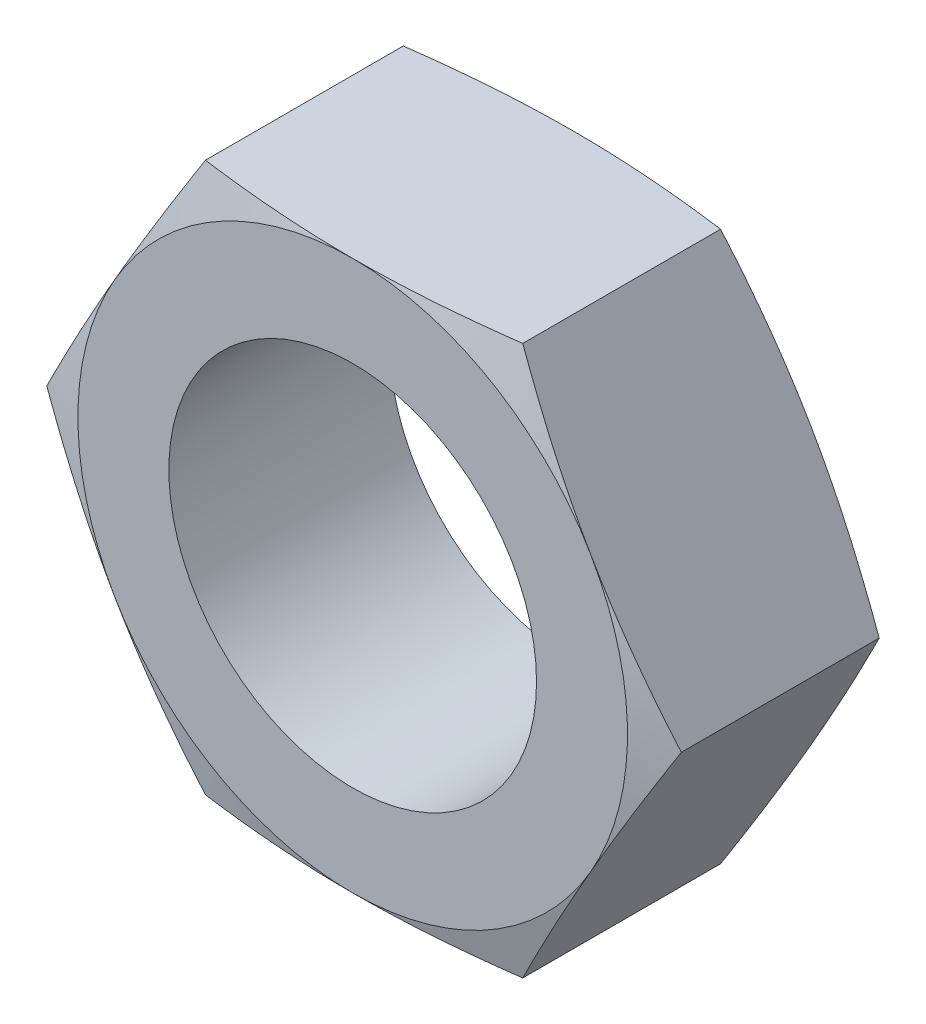
ISO-10303-21;
HEADER;
FILE_DESCRIPTION(('STEP AP214'),'2;1');
FILE_NAME('part.step','',(''),(''),'','','');
FILE_SCHEMA(('AUTOMOTIVE_DESIGN { 1 0 10303 214 1 1 1 1 }'));
ENDSEC;
DATA;
#1=APPLICATION_CONTEXT('core data for automotive mechanical design processes');
#2=APPLICATION_PROTOCOL_DEFINITION('international standard','automotive_design',2000,#1);
#3=PRODUCT_CONTEXT('',#1,'mechanical');
#4=PRODUCT('Part','Part','',(#3));
#5=PRODUCT_RELATED_PRODUCT_CATEGORY('part','',(#4));
#6=PRODUCT_DEFINITION_FORMATION('','',#4);
#7=PRODUCT_DEFINITION_CONTEXT('part definition',#1,'design');
#8=PRODUCT_DEFINITION('design','',#6,#7);
#9=PRODUCT_DEFINITION_SHAPE('','',#8);
#10=(LENGTH_UNIT() NAMED_UNIT(*) SI_UNIT(.MILLI.,.METRE.));
#11=(NAMED_UNIT(*) PLANE_ANGLE_UNIT() SI_UNIT($,.RADIAN.));
#12=(NAMED_UNIT(*) SI_UNIT($,.STERADIAN.) SOLID_ANGLE_UNIT());
#13=UNCERTAINTY_MEASURE_WITH_UNIT(LENGTH_MEASURE(1.E-05),#10,'distance_accuracy_value','');
#14=(GEOMETRIC_REPRESENTATION_CONTEXT(3) GLOBAL_UNCERTAINTY_ASSIGNED_CONTEXT((#13)) GLOBAL_UNIT_ASSIGNED_CONTEXT((#10,
#11,#12)) REPRESENTATION_CONTEXT('',''));
#15=CARTESIAN_POINT('',(0.,0.,0.));
#16=DIRECTION('',(0.,0.,1.));
#17=DIRECTION('',(1.,0.,0.));
#18=AXIS2_PLACEMENT_3D('',#15,#16,#17);
#19=CARTESIAN_POINT('',(4.315,0.,3.));
#20=DIRECTION('',(-0.866025403784439,-0.5,0.));
#21=DIRECTION('',(0.5,-0.866025403784439,0.));
#22=AXIS2_PLACEMENT_3D('',#19,#20,#21);
#23=PLANE('',#22);
#24=CARTESIAN_POINT('',(4.31511547005384,-0.000200000000000452,2.84506752796983));
#25=CARTESIAN_POINT('',(4.22551035478696,0.155000612260299,2.86908815461385));
#26=CARTESIAN_POINT('',(4.13574276654007,0.310482635976834,2.89089498601986));
#27=CARTESIAN_POINT('',(3.95589054372347,0.62199582374939,2.92920762362739));
#28=CARTESIAN_POINT('',(3.86580579533392,0.778027184947147,2.94571127628426));
#29=CARTESIAN_POINT('',(3.68586548159872,1.0896929506664,2.97245401276311));
#30=CARTESIAN_POINT('',(3.59601113322006,1.24532524733923,2.98272499096088));
#31=CARTESIAN_POINT('',(3.41618783952833,1.55678832839769,2.99649732958352));
#32=CARTESIAN_POINT('',(3.32621891976416,1.71261906853131,3.));
#33=CARTESIAN_POINT('',(3.14628108023584,2.02428054879855,3.));
#34=CARTESIAN_POINT('',(3.05631216047167,2.18011128893217,2.99649732958352));
#35=CARTESIAN_POINT('',(2.87648886677994,2.49157436999062,2.98272499096088));
#36=CARTESIAN_POINT('',(2.78663451840128,2.64720666666345,2.97245401276311));
#37=CARTESIAN_POINT('',(2.60669420466608,2.95887243238271,2.94571127628426));
#38=CARTESIAN_POINT('',(2.51660945627653,3.11490379358046,2.92920762362739));
#39=CARTESIAN_POINT('',(2.33675723345993,3.42641698135302,2.89089498601986));
#40=CARTESIAN_POINT('',(2.24698964521304,3.58189900506955,2.86908815461385));
#41=CARTESIAN_POINT('',(2.15738452994616,3.73709961732985,2.84506752796983));
#42=B_SPLINE_CURVE_WITH_KNOTS('',3,(#24,#25,#26,#27,#28,#29,#30,#31,#32,#33,#34,#35,#36,#37,#38,
#39,#40,#41),.UNSPECIFIED.,.F.,.F.,(4,2,2,2,2,2,2,2,4),(0.,0.542467064007844,1.0851541385181,
1.62504018009712,2.16482171740876,2.7046032547204,3.24448929629942,3.78717637080968,
4.32964343481752),.UNSPECIFIED.);
#43=CARTESIAN_POINT('',(4.315,0.,2.84509846931942));
#44=VERTEX_POINT('',#43);
#45=CARTESIAN_POINT('',(3.23625000000001,1.86844980866493,3.));
#46=VERTEX_POINT('',#45);
#47=EDGE_CURVE('E63',#44,#46,#42,.T.);
#48=ORIENTED_EDGE('',*,*,#47,.F.);
#49=DIRECTION('',(0.,0.,-1.));
#50=VECTOR('',#49,1.);
#51=CARTESIAN_POINT('',(4.315,0.,3.));
#52=LINE('',#51,#50);
#53=CARTESIAN_POINT('',(4.315,0.,0.154901530680586));
#54=VERTEX_POINT('',#53);
#55=EDGE_CURVE('E298',#44,#54,#52,.T.);
#56=ORIENTED_EDGE('',*,*,#55,.T.);
#57=CARTESIAN_POINT('',(2.15738452994616,3.73709961732985,0.154932472030172));
#58=CARTESIAN_POINT('',(2.24698964521304,3.58189900506955,0.130911845386149));
#59=CARTESIAN_POINT('',(2.33675723345993,3.42641698135302,0.109105013980143));
#60=CARTESIAN_POINT('',(2.51660945627653,3.11490379358046,0.0707923763726076));
#61=CARTESIAN_POINT('',(2.60669420466608,2.9588724323827,0.0542887237157463));
#62=CARTESIAN_POINT('',(2.78663451840128,2.64720666666345,0.0275459872368922));
#63=CARTESIAN_POINT('',(2.87648886677994,2.49157436999062,0.0172750090391264));
#64=CARTESIAN_POINT('',(3.05631216047167,2.18011128893216,0.00350267041647866));
#65=CARTESIAN_POINT('',(3.14628108023584,2.02428054879854,0.));
#66=CARTESIAN_POINT('',(3.32621891976416,1.71261906853131,0.));
#67=CARTESIAN_POINT('',(3.41618783952833,1.55678832839769,0.00350267041647869));
#68=CARTESIAN_POINT('',(3.59601113322006,1.24532524733923,0.0172750090391264));
#69=CARTESIAN_POINT('',(3.68586548159872,1.0896929506664,0.0275459872368922));
#70=CARTESIAN_POINT('',(3.86580579533392,0.778027184947147,0.0542887237157464));
#71=CARTESIAN_POINT('',(3.95589054372347,0.621995823749389,0.0707923763726077));
#72=CARTESIAN_POINT('',(4.13574276654007,0.310482635976833,0.109105013980143));
#73=CARTESIAN_POINT('',(4.22551035478696,0.155000612260299,0.130911845386149));
#74=CARTESIAN_POINT('',(4.31511547005384,-0.000200000000000997,0.154932472030172));
#75=B_SPLINE_CURVE_WITH_KNOTS('',3,(#57,#58,#59,#60,#61,#62,#63,#64,#65,#66,#67,#68,#69,#70,#71,
#72,#73,#74),.UNSPECIFIED.,.F.,.F.,(4,2,2,2,2,2,2,2,4),(0.,0.542467064007843,1.0851541385181,
1.62504018009712,2.16482171740876,2.7046032547204,3.24448929629942,3.78717637080968,
4.32964343481752),.UNSPECIFIED.);
#76=CARTESIAN_POINT('',(3.23625,1.86844980866493,0.));
#77=VERTEX_POINT('',#76);
#78=EDGE_CURVE('E234',#77,#54,#75,.T.);
#79=ORIENTED_EDGE('',*,*,#78,.F.);
#80=CARTESIAN_POINT('',(2.1575,3.73689961732985,0.154901530680586));
#81=VERTEX_POINT('',#80);
#82=EDGE_CURVE('E243',#81,#77,#75,.T.);
#83=ORIENTED_EDGE('',*,*,#82,.F.);
#84=DIRECTION('',(0.,0.,-1.));
#85=VECTOR('',#84,1.);
#86=CARTESIAN_POINT('',(2.1575,3.73689961732985,3.));
#87=LINE('',#86,#85);
#88=CARTESIAN_POINT('',(2.1575,3.73689961732985,2.84509846931942));
#89=VERTEX_POINT('',#88);
#90=EDGE_CURVE('E278',#89,#81,#87,.T.);
#91=ORIENTED_EDGE('',*,*,#90,.F.);
#92=EDGE_CURVE('E191',#46,#89,#42,.T.);
#93=ORIENTED_EDGE('',*,*,#92,.F.);
#94=EDGE_LOOP('',(#48,#56,#79,#83,#91,#93));
#95=FACE_BOUND('',#94,.T.);
#96=ADVANCED_FACE('F40',(#95),#23,.F.);
#97=CARTESIAN_POINT('',(2.1575,3.73689961732985,3.));
#98=DIRECTION('',(0.,-1.,0.));
#99=DIRECTION('',(1.,0.,0.));
#100=AXIS2_PLACEMENT_3D('',#97,#98,#99);
#101=PLANE('',#100);
#102=CARTESIAN_POINT('',(-5.80151524475316,3.73689961732985,2.15221686332605));
#103=CARTESIAN_POINT('',(-5.63080484623373,3.73689961732985,2.19066155603297));
#104=CARTESIAN_POINT('',(-5.45999020185033,3.73689961732985,2.22865139235711));
#105=CARTESIAN_POINT('',(-5.11810098133914,3.73689961732985,2.30347550775486));
#106=CARTESIAN_POINT('',(-4.94702639487129,3.73689961732985,2.34030973952806));
#107=CARTESIAN_POINT('',(-4.60443011766542,3.73689961732985,2.41260520401305));
#108=CARTESIAN_POINT('',(-4.43290816680977,3.73689961732985,2.44806520831243));
#109=CARTESIAN_POINT('',(-4.08951383819659,3.73689961732985,2.51724493002864));
#110=CARTESIAN_POINT('',(-3.91764146323621,3.73689961732985,2.55096466128054));
#111=CARTESIAN_POINT('',(-3.57501175609257,3.73689961732985,2.61595741745764));
#112=CARTESIAN_POINT('',(-3.40425805431132,3.73689961732985,2.64724949021833));
#113=CARTESIAN_POINT('',(-3.06229038252228,3.73689961732985,2.70720392888805));
#114=CARTESIAN_POINT('',(-2.89107642229689,3.73689961732985,2.73586635024023));
#115=CARTESIAN_POINT('',(-2.5481414379767,3.73689961732985,2.78993689519569));
#116=CARTESIAN_POINT('',(-2.37642044450969,3.73689961732985,2.81534521141197));
#117=CARTESIAN_POINT('',(-2.03242718262465,3.73689961732985,2.86217653987875));
#118=CARTESIAN_POINT('',(-1.86015490552506,3.73689961732985,2.88359948905083));
#119=CARTESIAN_POINT('',(-1.51305814938705,3.73689961732985,2.92187706082631));
#120=CARTESIAN_POINT('',(-1.33822736921192,3.73689961732985,2.93867537945675));
#121=CARTESIAN_POINT('',(-0.988117632410056,3.73689961732985,2.96655421251849));
#122=CARTESIAN_POINT('',(-0.812838715797122,3.73689961732985,2.97763522067832));
#123=CARTESIAN_POINT('',(-0.462080063185808,3.73689961732985,2.99343663543133));
#124=CARTESIAN_POINT('',(-0.286600479465507,3.73689961732985,2.99816035410356));
#125=CARTESIAN_POINT('',(0.064412310664684,3.73689961732985,3.00095488287757));
#126=CARTESIAN_POINT('',(0.239945516930652,3.73689961732985,2.99902571068151));
#127=CARTESIAN_POINT('',(0.591608810397687,3.73689961732985,2.98861697977495));
#128=CARTESIAN_POINT('',(0.767738003152263,3.73689961732985,2.98010781229066));
#129=CARTESIAN_POINT('',(1.11960030323216,3.73689961732985,2.95702605624855));
#130=CARTESIAN_POINT('',(1.2953333889756,3.73689961732985,2.94245314497045));
#131=CARTESIAN_POINT('',(1.64640069643039,3.73689961732985,2.90800325969772));
#132=CARTESIAN_POINT('',(1.82173453139605,3.73689961732985,2.88812240598557));
#133=CARTESIAN_POINT('',(2.17183237115893,3.73689961732985,2.84391293686763));
#134=CARTESIAN_POINT('',(2.34659637819106,3.73689961732985,2.81958433892748));
#135=CARTESIAN_POINT('',(2.73136141502651,3.73689961732985,2.76192692136813));
#136=CARTESIAN_POINT('',(2.94123824817646,3.73689961732985,2.72777555487978));
#137=CARTESIAN_POINT('',(3.36029112029755,3.73689961732985,2.65539585599433));
#138=CARTESIAN_POINT('',(3.56946712011161,3.73689961732985,2.61716729958827));
#139=CARTESIAN_POINT('',(3.98726013290902,3.73689961732985,2.5375736475276));
#140=CARTESIAN_POINT('',(4.19587702863078,3.73689961732985,2.4962079402142));
#141=CARTESIAN_POINT('',(4.61261820934391,3.73689961732985,2.41105816603964));
#142=CARTESIAN_POINT('',(4.82074248463981,3.73689961732985,2.36727405198677));
#143=CARTESIAN_POINT('',(5.44475411173289,3.73689961732985,2.23308519767846));
#144=CARTESIAN_POINT('',(5.86004015637117,3.73689961732985,2.13989110761835));
#145=CARTESIAN_POINT('',(6.68949095509335,3.73689961732985,1.94892065613413));
#146=CARTESIAN_POINT('',(7.10365584019466,3.73689961732985,1.85114485694529));
#147=CARTESIAN_POINT('',(7.92503507175334,3.73689961732985,1.65406218003753));
#148=CARTESIAN_POINT('',(8.33226027406343,3.73689961732985,1.55480044311865));
#149=CARTESIAN_POINT('',(9.14622825005755,3.73689961732985,1.3542591115804));
#150=CARTESIAN_POINT('',(9.55297100497373,3.73689961732985,1.25297944102294));
#151=CARTESIAN_POINT('',(10.3653204496259,3.73689961732985,1.04918645786517));
#152=CARTESIAN_POINT('',(10.7709278248388,3.73689961732985,0.946675873205935));
#153=CARTESIAN_POINT('',(11.5818509725991,3.73689961732985,0.740590370316664));
#154=CARTESIAN_POINT('',(11.9871667585371,3.73689961732985,0.637015504808609));
#155=CARTESIAN_POINT('',(12.3923897414789,3.73689961732985,0.533082818793631));
#156=B_SPLINE_CURVE_WITH_KNOTS('',3,(#102,#103,#104,#105,#106,#107,#108,#109,#110,#111,#112,
#113,#114,#115,#116,#117,#118,#119,#120,#121,#122,#123,#124,#125,#126,#127,#128,#129,#130,#131,
#132,#133,#134,#135,#136,#137,#138,#139,#140,#141,#142,#143,#144,#145,#146,#147,#148,#149,#150,
#151,#152,#153,#154,#155),.UNSPECIFIED.,.F.,.F.,(4,2,2,2,2,2,2,2,2,2,2,2,2,2,2,2,2,2,2,2,2,2,2,
2,2,2,4),(0.,0.524959460931264,1.04994038118058,1.57538023499529,2.10081591094715,
2.62159139474941,3.14235589607881,3.66308955869546,4.18383146252783,4.71065803046813,
5.23743909574364,5.76394560740262,6.2904507181237,6.81933889114439,7.34825521587828,
7.8775592031801,8.40686111202796,9.04471827620287,9.68261050359688,10.3206274238944,
10.958656798569,12.2354495101611,13.5120859509054,14.7695228253286,16.0270071088407,
17.2820878854116,18.5371067851159),.UNSPECIFIED.);
#157=CARTESIAN_POINT('',(0.,3.73689961732986,3.));
#158=VERTEX_POINT('',#157);
#159=EDGE_CURVE('E56',#89,#158,#156,.F.);
#160=ORIENTED_EDGE('',*,*,#159,.F.);
#161=ORIENTED_EDGE('',*,*,#90,.T.);
#162=CARTESIAN_POINT('',(-5.80151524475316,3.73689961732985,0.847783136673954));
#163=CARTESIAN_POINT('',(-5.63080484623373,3.73689961732985,0.809338443967031));
#164=CARTESIAN_POINT('',(-5.45999020185033,3.73689961732985,0.771348607642888));
#165=CARTESIAN_POINT('',(-5.11810098133914,3.73689961732985,0.696524492245143));
#166=CARTESIAN_POINT('',(-4.94702639487129,3.73689961732985,0.659690260471947));
#167=CARTESIAN_POINT('',(-4.60443011766542,3.73689961732985,0.587394795986948));
#168=CARTESIAN_POINT('',(-4.43290816680977,3.73689961732985,0.551934791687569));
#169=CARTESIAN_POINT('',(-4.08951383819659,3.73689961732985,0.482755069971364));
#170=CARTESIAN_POINT('',(-3.91764146323621,3.73689961732985,0.449035338719459));
#171=CARTESIAN_POINT('',(-3.57501175609257,3.73689961732985,0.384042582542366));
#172=CARTESIAN_POINT('',(-3.40425805431132,3.73689961732985,0.352750509781671));
#173=CARTESIAN_POINT('',(-3.06229038252228,3.73689961732985,0.29279607111195));
#174=CARTESIAN_POINT('',(-2.89107642229689,3.73689961732985,0.264133649759768));
#175=CARTESIAN_POINT('',(-2.5481414379767,3.73689961732985,0.210063104804307));
#176=CARTESIAN_POINT('',(-2.37642044450969,3.73689961732985,0.184654788588036));
#177=CARTESIAN_POINT('',(-2.03242718262465,3.73689961732985,0.137823460121251));
#178=CARTESIAN_POINT('',(-1.86015490552506,3.73689961732985,0.116400510949171));
#179=CARTESIAN_POINT('',(-1.51305814938705,3.73689961732985,0.0781229391736908));
#180=CARTESIAN_POINT('',(-1.33822736921192,3.73689961732985,0.0613246205432524));
#181=CARTESIAN_POINT('',(-0.988117632410056,3.73689961732985,0.0334457874815125));
#182=CARTESIAN_POINT('',(-0.812838715797122,3.73689961732985,0.0223647793216784));
#183=CARTESIAN_POINT('',(-0.462080063185808,3.73689961732985,0.00656336456866793));
#184=CARTESIAN_POINT('',(-0.286600479465507,3.73689961732985,0.00183964589644661));
#185=CARTESIAN_POINT('',(0.064412310664684,3.73689961732985,-0.000954882877570074));
#186=CARTESIAN_POINT('',(0.239945516930652,3.73689961732985,0.000974289318490405));
#187=CARTESIAN_POINT('',(0.591608810397687,3.73689961732985,0.0113830202250487));
#188=CARTESIAN_POINT('',(0.767738003152262,3.73689961732985,0.0198921877093433));
#189=CARTESIAN_POINT('',(1.11960030323216,3.73689961732985,0.0429739437514551));
#190=CARTESIAN_POINT('',(1.2953333889756,3.73689961732985,0.0575468550295547));
#191=CARTESIAN_POINT('',(1.64640069643039,3.73689961732985,0.0919967403022771));
#192=CARTESIAN_POINT('',(1.82173453139605,3.73689961732985,0.11187759401443));
#193=CARTESIAN_POINT('',(2.17183237115893,3.73689961732985,0.156087063132367));
#194=CARTESIAN_POINT('',(2.34659637819106,3.73689961732985,0.180415661072518));
#195=CARTESIAN_POINT('',(2.73136141502651,3.73689961732985,0.238073078631875));
#196=CARTESIAN_POINT('',(2.94123824817646,3.73689961732985,0.272224445120225));
#197=CARTESIAN_POINT('',(3.36029112029755,3.73689961732985,0.34460414400567));
#198=CARTESIAN_POINT('',(3.56946712011161,3.73689961732985,0.382832700411733));
#199=CARTESIAN_POINT('',(3.98726013290902,3.73689961732985,0.462426352472406));
#200=CARTESIAN_POINT('',(4.19587702863078,3.73689961732985,0.503792059785799));
#201=CARTESIAN_POINT('',(4.61261820934391,3.73689961732985,0.588941833960361));
#202=CARTESIAN_POINT('',(4.82074248463981,3.73689961732985,0.632725948013234));
#203=CARTESIAN_POINT('',(5.44475411173289,3.73689961732985,0.766914802321547));
#204=CARTESIAN_POINT('',(5.86004015637117,3.73689961732985,0.860108892381649));
#205=CARTESIAN_POINT('',(6.68949095509335,3.73689961732985,1.05107934386587));
#206=CARTESIAN_POINT('',(7.10365584019466,3.73689961732985,1.14885514305472));
#207=CARTESIAN_POINT('',(7.92503507175334,3.73689961732985,1.34593781996247));
#208=CARTESIAN_POINT('',(8.33226027406343,3.73689961732985,1.44519955688136));
#209=CARTESIAN_POINT('',(9.14622825005755,3.73689961732985,1.6457408884196));
#210=CARTESIAN_POINT('',(9.55297100497373,3.73689961732985,1.74702055897706));
#211=CARTESIAN_POINT('',(10.3653204496259,3.73689961732985,1.95081354213483));
#212=CARTESIAN_POINT('',(10.7709278248388,3.73689961732985,2.05332412679407));
#213=CARTESIAN_POINT('',(11.5818509725991,3.73689961732985,2.25940962968334));
#214=CARTESIAN_POINT('',(11.9871667585371,3.73689961732985,2.36298449519139));
#215=CARTESIAN_POINT('',(12.3923897414789,3.73689961732985,2.46691718120637));
#216=B_SPLINE_CURVE_WITH_KNOTS('',3,(#162,#163,#164,#165,#166,#167,#168,#169,#170,#171,#172,
#173,#174,#175,#176,#177,#178,#179,#180,#181,#182,#183,#184,#185,#186,#187,#188,#189,#190,#191,
#192,#193,#194,#195,#196,#197,#198,#199,#200,#201,#202,#203,#204,#205,#206,#207,#208,#209,#210,
#211,#212,#213,#214,#215),.UNSPECIFIED.,.F.,.F.,(4,2,2,2,2,2,2,2,2,2,2,2,2,2,2,2,2,2,2,2,2,2,2,
2,2,2,4),(0.,0.524959460931264,1.04994038118058,1.57538023499529,2.10081591094715,
2.62159139474941,3.14235589607881,3.66308955869546,4.18383146252783,4.71065803046813,
5.23743909574364,5.76394560740262,6.2904507181237,6.81933889114439,7.34825521587828,
7.87755920318011,8.40686111202796,9.04471827620287,9.68261050359688,10.3206274238944,
10.958656798569,12.2354495101611,13.5120859509054,14.7695228253286,16.0270071088407,
17.2820878854116,18.5371067851159),.UNSPECIFIED.);
#217=CARTESIAN_POINT('',(0.,3.73689961732985,0.));
#218=VERTEX_POINT('',#217);
#219=EDGE_CURVE('E251',#218,#81,#216,.T.);
#220=ORIENTED_EDGE('',*,*,#219,.F.);
#221=CARTESIAN_POINT('',(-2.1575,3.73689961732985,0.154901530680586));
#222=VERTEX_POINT('',#221);
#223=EDGE_CURVE('E259',#222,#218,#216,.T.);
#224=ORIENTED_EDGE('',*,*,#223,.F.);
#225=DIRECTION('',(0.,0.,-1.));
#226=VECTOR('',#225,1.);
#227=CARTESIAN_POINT('',(-2.1575,3.73689961732985,3.));
#228=LINE('',#227,#226);
#229=CARTESIAN_POINT('',(-2.1575,3.73689961732985,2.84509846931942));
#230=VERTEX_POINT('',#229);
#231=EDGE_CURVE('E284',#230,#222,#228,.T.);
#232=ORIENTED_EDGE('',*,*,#231,.F.);
#233=EDGE_CURVE('E135',#158,#230,#156,.F.);
#234=ORIENTED_EDGE('',*,*,#233,.F.);
#235=EDGE_LOOP('',(#160,#161,#220,#224,#232,#234));
#236=FACE_BOUND('',#235,.T.);
#237=ADVANCED_FACE('F266',(#236),#101,.F.);
#238=CARTESIAN_POINT('',(-2.1575,3.73689961732985,3.));
#239=DIRECTION('',(0.866025403784439,-0.5,0.));
#240=DIRECTION('',(0.5,0.866025403784439,0.));
#241=AXIS2_PLACEMENT_3D('',#238,#239,#240);
#242=PLANE('',#241);
#243=CARTESIAN_POINT('',(-2.15738452994616,3.73709961732985,2.84506752796983));
#244=CARTESIAN_POINT('',(-2.24698964521304,3.58189900506955,2.86908815461385));
#245=CARTESIAN_POINT('',(-2.33675723345993,3.42641698135302,2.89089498601986));
#246=CARTESIAN_POINT('',(-2.51660945627653,3.11490379358046,2.92920762362739));
#247=CARTESIAN_POINT('',(-2.60669420466608,2.95887243238271,2.94571127628426));
#248=CARTESIAN_POINT('',(-2.78663451840128,2.64720666666345,2.97245401276311));
#249=CARTESIAN_POINT('',(-2.87648886677994,2.49157436999062,2.98272499096088));
#250=CARTESIAN_POINT('',(-3.05631216047167,2.18011128893217,2.99649732958352));
#251=CARTESIAN_POINT('',(-3.14628108023584,2.02428054879855,3.));
#252=CARTESIAN_POINT('',(-3.32621891976416,1.71261906853131,3.));
#253=CARTESIAN_POINT('',(-3.41618783952833,1.55678832839769,2.99649732958352));
#254=CARTESIAN_POINT('',(-3.59601113322006,1.24532524733923,2.98272499096088));
#255=CARTESIAN_POINT('',(-3.68586548159872,1.0896929506664,2.97245401276311));
#256=CARTESIAN_POINT('',(-3.86580579533392,0.778027184947147,2.94571127628426));
#257=CARTESIAN_POINT('',(-3.95589054372347,0.621995823749389,2.92920762362739));
#258=CARTESIAN_POINT('',(-4.13574276654007,0.310482635976834,2.89089498601986));
#259=CARTESIAN_POINT('',(-4.22551035478696,0.155000612260299,2.86908815461385));
#260=CARTESIAN_POINT('',(-4.31511547005384,-0.000200000000001589,2.84506752796983));
#261=B_SPLINE_CURVE_WITH_KNOTS('',3,(#243,#244,#245,#246,#247,#248,#249,#250,#251,#252,#253,
#254,#255,#256,#257,#258,#259,#260),.UNSPECIFIED.,.F.,.F.,(4,2,2,2,2,2,2,2,4),(0.,
0.542467064007844,1.0851541385181,1.62504018009712,2.16482171740876,2.7046032547204,
3.24448929629942,3.78717637080968,4.32964343481752),.UNSPECIFIED.);
#262=CARTESIAN_POINT('',(-3.23625000000001,1.86844980866493,3.));
#263=VERTEX_POINT('',#262);
#264=EDGE_CURVE('E129',#230,#263,#261,.T.);
#265=ORIENTED_EDGE('',*,*,#264,.F.);
#266=ORIENTED_EDGE('',*,*,#231,.T.);
#267=CARTESIAN_POINT('',(-4.31511547005384,-0.000200000000000956,0.154932472030172));
#268=CARTESIAN_POINT('',(-4.22551035478696,0.155000612260299,0.130911845386149));
#269=CARTESIAN_POINT('',(-4.13574276654007,0.310482635976833,0.109105013980143));
#270=CARTESIAN_POINT('',(-3.95589054372347,0.621995823749389,0.0707923763726077));
#271=CARTESIAN_POINT('',(-3.86580579533392,0.778027184947147,0.0542887237157462));
#272=CARTESIAN_POINT('',(-3.68586548159872,1.0896929506664,0.0275459872368921));
#273=CARTESIAN_POINT('',(-3.59601113322006,1.24532524733923,0.0172750090391264));
#274=CARTESIAN_POINT('',(-3.41618783952833,1.55678832839769,0.00350267041647865));
#275=CARTESIAN_POINT('',(-3.32621891976416,1.71261906853131,0.));
#276=CARTESIAN_POINT('',(-3.14628108023584,2.02428054879855,0.));
#277=CARTESIAN_POINT('',(-3.05631216047167,2.18011128893217,0.00350267041647857));
#278=CARTESIAN_POINT('',(-2.87648886677994,2.49157436999062,0.0172750090391263));
#279=CARTESIAN_POINT('',(-2.78663451840128,2.64720666666345,0.0275459872368922));
#280=CARTESIAN_POINT('',(-2.60669420466608,2.95887243238271,0.0542887237157464));
#281=CARTESIAN_POINT('',(-2.51660945627653,3.11490379358046,0.0707923763726077));
#282=CARTESIAN_POINT('',(-2.33675723345993,3.42641698135302,0.109105013980143));
#283=CARTESIAN_POINT('',(-2.24698964521304,3.58189900506955,0.130911845386149));
#284=CARTESIAN_POINT('',(-2.15738452994616,3.73709961732985,0.154932472030172));
#285=B_SPLINE_CURVE_WITH_KNOTS('',3,(#267,#268,#269,#270,#271,#272,#273,#274,#275,#276,#277,
#278,#279,#280,#281,#282,#283,#284),.UNSPECIFIED.,.F.,.F.,(4,2,2,2,2,2,2,2,4),(0.,
0.542467064007843,1.0851541385181,1.62504018009712,2.16482171740876,2.7046032547204,
3.24448929629942,3.78717637080968,4.32964343481752),.UNSPECIFIED.);
#286=CARTESIAN_POINT('',(-3.23625,1.86844980866493,0.));
#287=VERTEX_POINT('',#286);
#288=EDGE_CURVE('E260',#287,#222,#285,.T.);
#289=ORIENTED_EDGE('',*,*,#288,.F.);
#290=CARTESIAN_POINT('',(-4.315,0.,0.154901530680586));
#291=VERTEX_POINT('',#290);
#292=EDGE_CURVE('E303',#291,#287,#285,.T.);
#293=ORIENTED_EDGE('',*,*,#292,.F.);
#294=DIRECTION('',(0.,0.,-1.));
#295=VECTOR('',#294,1.);
#296=CARTESIAN_POINT('',(-4.315,0.,3.));
#297=LINE('',#296,#295);
#298=CARTESIAN_POINT('',(-4.315,0.,2.84509846931942));
#299=VERTEX_POINT('',#298);
#300=EDGE_CURVE('E158',#299,#291,#297,.T.);
#301=ORIENTED_EDGE('',*,*,#300,.F.);
#302=EDGE_CURVE('E139',#263,#299,#261,.T.);
#303=ORIENTED_EDGE('',*,*,#302,.F.);
#304=EDGE_LOOP('',(#265,#266,#289,#293,#301,#303));
#305=FACE_BOUND('',#304,.T.);
#306=ADVANCED_FACE('F156',(#305),#242,.F.);
#307=CARTESIAN_POINT('',(-4.315,0.,3.));
#308=DIRECTION('',(0.866025403784438,0.5,0.));
#309=DIRECTION('',(-0.5,0.866025403784439,0.));
#310=AXIS2_PLACEMENT_3D('',#307,#308,#309);
#311=PLANE('',#310);
#312=CARTESIAN_POINT('',(-4.31511547005384,0.000199999999999089,2.84506752796983));
#313=CARTESIAN_POINT('',(-4.22551035478696,-0.155000612260301,2.86908815461385));
#314=CARTESIAN_POINT('',(-4.13574276654007,-0.310482635976835,2.89089498601986));
#315=CARTESIAN_POINT('',(-3.95589054372347,-0.621995823749391,2.92920762362739));
#316=CARTESIAN_POINT('',(-3.86580579533392,-0.778027184947148,2.94571127628426));
#317=CARTESIAN_POINT('',(-3.68586548159872,-1.0896929506664,2.97245401276311));
#318=CARTESIAN_POINT('',(-3.59601113322006,-1.24532524733923,2.98272499096088));
#319=CARTESIAN_POINT('',(-3.41618783952833,-1.55678832839769,2.99649732958352));
#320=CARTESIAN_POINT('',(-3.32621891976416,-1.71261906853131,3.));
#321=CARTESIAN_POINT('',(-3.14628108023584,-2.02428054879855,3.));
#322=CARTESIAN_POINT('',(-3.05631216047167,-2.18011128893217,2.99649732958352));
#323=CARTESIAN_POINT('',(-2.87648886677994,-2.49157436999062,2.98272499096088));
#324=CARTESIAN_POINT('',(-2.78663451840128,-2.64720666666345,2.97245401276311));
#325=CARTESIAN_POINT('',(-2.60669420466608,-2.95887243238271,2.94571127628426));
#326=CARTESIAN_POINT('',(-2.51660945627653,-3.11490379358046,2.92920762362739));
#327=CARTESIAN_POINT('',(-2.33675723345993,-3.42641698135302,2.89089498601986));
#328=CARTESIAN_POINT('',(-2.24698964521304,-3.58189900506955,2.86908815461385));
#329=CARTESIAN_POINT('',(-2.15738452994616,-3.73709961732985,2.84506752796983));
#330=B_SPLINE_CURVE_WITH_KNOTS('',3,(#312,#313,#314,#315,#316,#317,#318,#319,#320,#321,#322,
#323,#324,#325,#326,#327,#328,#329),.UNSPECIFIED.,.F.,.F.,(4,2,2,2,2,2,2,2,4),(0.,
0.542467064007843,1.0851541385181,1.62504018009712,2.16482171740876,2.7046032547204,
3.24448929629942,3.78717637080968,4.32964343481752),.UNSPECIFIED.);
#331=CARTESIAN_POINT('',(-3.23625000000001,-1.86844980866493,3.));
#332=VERTEX_POINT('',#331);
#333=EDGE_CURVE('E146',#299,#332,#330,.T.);
#334=ORIENTED_EDGE('',*,*,#333,.F.);
#335=ORIENTED_EDGE('',*,*,#300,.T.);
#336=CARTESIAN_POINT('',(-2.15738452994616,-3.73709961732985,0.154932472030172));
#337=CARTESIAN_POINT('',(-2.24698964521304,-3.58189900506955,0.130911845386149));
#338=CARTESIAN_POINT('',(-2.33675723345993,-3.42641698135302,0.109105013980143));
#339=CARTESIAN_POINT('',(-2.51660945627653,-3.11490379358046,0.0707923763726076));
#340=CARTESIAN_POINT('',(-2.60669420466608,-2.9588724323827,0.0542887237157462));
#341=CARTESIAN_POINT('',(-2.78663451840128,-2.64720666666345,0.0275459872368921));
#342=CARTESIAN_POINT('',(-2.87648886677994,-2.49157436999062,0.0172750090391264));
#343=CARTESIAN_POINT('',(-3.05631216047167,-2.18011128893217,0.00350267041647873));
#344=CARTESIAN_POINT('',(-3.14628108023584,-2.02428054879855,0.));
#345=CARTESIAN_POINT('',(-3.32621891976416,-1.71261906853131,0.));
#346=CARTESIAN_POINT('',(-3.41618783952833,-1.55678832839769,0.00350267041647873));
#347=CARTESIAN_POINT('',(-3.59601113322006,-1.24532524733923,0.0172750090391264));
#348=CARTESIAN_POINT('',(-3.68586548159872,-1.0896929506664,0.0275459872368922));
#349=CARTESIAN_POINT('',(-3.86580579533392,-0.778027184947147,0.0542887237157464));
#350=CARTESIAN_POINT('',(-3.95589054372347,-0.62199582374939,0.0707923763726078));
#351=CARTESIAN_POINT('',(-4.13574276654007,-0.310482635976834,0.109105013980143));
#352=CARTESIAN_POINT('',(-4.22551035478696,-0.1550006122603,0.130911845386149));
#353=CARTESIAN_POINT('',(-4.31511547005384,0.000199999999999643,0.154932472030172));
#354=B_SPLINE_CURVE_WITH_KNOTS('',3,(#336,#337,#338,#339,#340,#341,#342,#343,#344,#345,#346,
#347,#348,#349,#350,#351,#352,#353),.UNSPECIFIED.,.F.,.F.,(4,2,2,2,2,2,2,2,4),(0.,
0.542467064007843,1.0851541385181,1.62504018009712,2.16482171740876,2.7046032547204,
3.24448929629942,3.78717637080968,4.32964343481752),.UNSPECIFIED.);
#355=CARTESIAN_POINT('',(-3.23625,-1.86844980866493,0.));
#356=VERTEX_POINT('',#355);
#357=EDGE_CURVE('E252',#356,#291,#354,.T.);
#358=ORIENTED_EDGE('',*,*,#357,.F.);
#359=CARTESIAN_POINT('',(-2.1575,-3.73689961732985,0.154901530680586));
#360=VERTEX_POINT('',#359);
#361=EDGE_CURVE('E244',#360,#356,#354,.T.);
#362=ORIENTED_EDGE('',*,*,#361,.F.);
#363=DIRECTION('',(0.,0.,-1.));
#364=VECTOR('',#363,1.);
#365=CARTESIAN_POINT('',(-2.1575,-3.73689961732985,3.));
#366=LINE('',#365,#364);
#367=CARTESIAN_POINT('',(-2.1575,-3.73689961732985,2.84509846931942));
#368=VERTEX_POINT('',#367);
#369=EDGE_CURVE('E294',#368,#360,#366,.T.);
#370=ORIENTED_EDGE('',*,*,#369,.F.);
#371=EDGE_CURVE('E159',#332,#368,#330,.T.);
#372=ORIENTED_EDGE('',*,*,#371,.F.);
#373=EDGE_LOOP('',(#334,#335,#358,#362,#370,#372));
#374=FACE_BOUND('',#373,.T.);
#375=ADVANCED_FACE('F220',(#374),#311,.F.);
#376=CARTESIAN_POINT('',(-2.1575,-3.73689961732985,3.));
#377=DIRECTION('',(0.,1.,0.));
#378=DIRECTION('',(-1.,0.,0.));
#379=AXIS2_PLACEMENT_3D('',#376,#377,#378);
#380=PLANE('',#379);
#381=CARTESIAN_POINT('',(-5.80151524316743,-3.73689961732985,2.15221686368325));
#382=CARTESIAN_POINT('',(-5.63080484471221,-3.73689961732985,2.19066155637264));
#383=CARTESIAN_POINT('',(-5.45999020039304,-3.73689961732985,2.22865139267931));
#384=CARTESIAN_POINT('',(-5.1181009800104,-3.73689961732985,2.30347550804236));
#385=CARTESIAN_POINT('',(-4.94702639360687,-3.73689961732985,2.34030973979833));
#386=CARTESIAN_POINT('',(-4.60443011652993,-3.73689961732985,2.41260520424922));
#387=CARTESIAN_POINT('',(-4.43290816573891,-3.73689961732985,2.44806520853172));
#388=CARTESIAN_POINT('',(-4.08951383725513,-3.73689961732985,2.51724493021475));
#389=CARTESIAN_POINT('',(-3.91764146235951,-3.73689961732985,2.55096466145037));
#390=CARTESIAN_POINT('',(-3.57501175534385,-3.73689961732985,2.61595741759616));
#391=CARTESIAN_POINT('',(-3.40425805362578,-3.73689961732985,2.64724949034182));
#392=CARTESIAN_POINT('',(-3.0622903819634,-3.73689961732985,2.70720392898274));
#393=CARTESIAN_POINT('',(-2.89107642180148,-3.73689961732985,2.73586635032115));
#394=CARTESIAN_POINT('',(-2.54814143760853,-3.73689961732985,2.78993689525094));
#395=CARTESIAN_POINT('',(-2.3764204442053,-3.73689961732985,2.8153452114553));
#396=CARTESIAN_POINT('',(-2.03242718244823,-3.73689961732985,2.86217653990087));
#397=CARTESIAN_POINT('',(-1.86015490541283,-3.73689961732985,2.88359948906365));
#398=CARTESIAN_POINT('',(-1.51305814941049,-3.73689961732985,2.92187706082328));
#399=CARTESIAN_POINT('',(-1.33822736930684,-3.73689961732985,2.93867537944737));
#400=CARTESIAN_POINT('',(-0.988117632648275,-3.73689961732985,2.96655421250134));
#401=CARTESIAN_POINT('',(-0.812838716107151,-3.73689961732985,2.97763522065975));
#402=CARTESIAN_POINT('',(-0.462080063639441,-3.73689961732985,2.9934366354155));
#403=CARTESIAN_POINT('',(-0.286600479990935,-3.73689961732985,2.99816035409187));
#404=CARTESIAN_POINT('',(0.0644123099959105,-3.73689961732985,3.00095488287975));
#405=CARTESIAN_POINT('',(0.239945516190327,-3.73689961732985,2.99902571069341));
#406=CARTESIAN_POINT('',(0.591608809514146,-3.73689961732985,2.98861697981117));
#407=CARTESIAN_POINT('',(0.767738002197062,-3.73689961732985,2.98010781234152));
#408=CARTESIAN_POINT('',(1.11960030213429,-3.73689961732985,2.95702605633237));
#409=CARTESIAN_POINT('',(1.29533338780671,-3.73689961732985,2.94245314507259));
#410=CARTESIAN_POINT('',(1.64640069511988,-3.73689961732985,2.90800325983891));
#411=CARTESIAN_POINT('',(1.82173453001493,-3.73689961732985,2.88812240614748));
#412=CARTESIAN_POINT('',(2.1718323696371,-3.73689961732985,2.84391293707231));
#413=CARTESIAN_POINT('',(2.34659637659911,-3.73689961732985,2.8195843391542));
#414=CARTESIAN_POINT('',(2.73136141336663,-3.73689961732985,2.76192692163115));
#415=CARTESIAN_POINT('',(2.9412382465185,-3.73689961732985,2.72777555515502));
#416=CARTESIAN_POINT('',(3.36029111864318,-3.73689961732985,2.6553958562912));
#417=CARTESIAN_POINT('',(3.5694671184589,-3.73689961732985,2.61716729989453));
#418=CARTESIAN_POINT('',(3.98726013125941,-3.73689961732985,2.53757364785047));
#419=CARTESIAN_POINT('',(4.1958770269826,-3.73689961732985,2.49620794054429));
#420=CARTESIAN_POINT('',(4.61261820769836,-3.73689961732985,2.41105816638251));
#421=CARTESIAN_POINT('',(4.82074248299544,-3.73689961732985,2.36727405233522));
#422=CARTESIAN_POINT('',(5.44475411009271,-3.73689961732985,2.23308519804162));
#423=CARTESIAN_POINT('',(5.86004015473367,-3.73689961732985,2.13989110798882));
#424=CARTESIAN_POINT('',(6.68949095346058,-3.73689961732985,1.94892065651652));
#425=CARTESIAN_POINT('',(7.10365583856393,-3.73689961732985,1.8511448573323));
#426=CARTESIAN_POINT('',(7.92503507012928,-3.73689961732985,1.65406218043141));
#427=CARTESIAN_POINT('',(8.332260272444,-3.73689961732986,1.55480044351476));
#428=CARTESIAN_POINT('',(9.14622824844718,-3.73689961732986,1.35425911198001));
#429=CARTESIAN_POINT('',(9.55297100336778,-3.73689961732986,1.2529794414238));
#430=CARTESIAN_POINT('',(10.365320448027,-3.73689961732986,1.04918645826832));
#431=CARTESIAN_POINT('',(10.7709278232425,-3.73689961732986,0.946675873610122));
#432=CARTESIAN_POINT('',(11.5818509710079,-3.73689961732986,0.740590370722511));
#433=CARTESIAN_POINT('',(11.9871667569483,-3.73689961732986,0.637015505215075));
#434=CARTESIAN_POINT('',(12.3923897398925,-3.73689961732986,0.533082819200596));
#435=B_SPLINE_CURVE_WITH_KNOTS('',3,(#381,#382,#383,#384,#385,#386,#387,#388,#389,#390,#391,
#392,#393,#394,#395,#396,#397,#398,#399,#400,#401,#402,#403,#404,#405,#406,#407,#408,#409,#410,
#411,#412,#413,#414,#415,#416,#417,#418,#419,#420,#421,#422,#423,#424,#425,#426,#427,#428,#429,
#430,#431,#432,#433,#434),.UNSPECIFIED.,.F.,.F.,(4,2,2,2,2,2,2,2,2,2,2,2,2,2,2,2,2,2,2,2,2,2,2,
2,2,2,4),(0.,0.524959460731774,1.04994038078159,1.5753802343962,2.10081591014797,
2.62159139375564,3.14235589489046,3.66308955731263,4.18383146095051,4.71065802867561,
5.23743909373599,5.76394560518016,6.29045071568643,6.81933888849038,7.34825521300747,
7.87755920009185,8.40686110872226,9.0447182728969,9.68261050029071,10.3206274205882,
10.9586567952629,12.2354495068579,13.512085947605,14.7695228220401,16.0270071055642,
17.2820878821418,18.5371067818529),.UNSPECIFIED.);
#436=CARTESIAN_POINT('',(0.,-3.73689961732986,3.));
#437=VERTEX_POINT('',#436);
#438=EDGE_CURVE('E214',#368,#437,#435,.T.);
#439=ORIENTED_EDGE('',*,*,#438,.F.);
#440=ORIENTED_EDGE('',*,*,#369,.T.);
#441=CARTESIAN_POINT('',(-5.80151524316743,-3.73689961732985,0.847783136316747));
#442=CARTESIAN_POINT('',(-5.63080484471221,-3.73689961732985,0.809338443627362));
#443=CARTESIAN_POINT('',(-5.45999020039304,-3.73689961732985,0.771348607320694));
#444=CARTESIAN_POINT('',(-5.1181009800104,-3.73689961732985,0.696524491957647));
#445=CARTESIAN_POINT('',(-4.94702639360687,-3.73689961732985,0.659690260201674));
#446=CARTESIAN_POINT('',(-4.60443011652993,-3.73689961732985,0.587394795750781));
#447=CARTESIAN_POINT('',(-4.43290816573891,-3.73689961732985,0.551934791468284));
#448=CARTESIAN_POINT('',(-4.08951383725513,-3.73689961732985,0.482755069785249));
#449=CARTESIAN_POINT('',(-3.91764146235951,-3.73689961732985,0.449035338549631));
#450=CARTESIAN_POINT('',(-3.57501175534385,-3.73689961732985,0.38404258240384));
#451=CARTESIAN_POINT('',(-3.40425805362579,-3.73689961732985,0.352750509658183));
#452=CARTESIAN_POINT('',(-3.0622903819634,-3.73689961732985,0.292796071017266));
#453=CARTESIAN_POINT('',(-2.89107642180148,-3.73689961732985,0.264133649678849));
#454=CARTESIAN_POINT('',(-2.54814143760853,-3.73689961732985,0.210063104749064));
#455=CARTESIAN_POINT('',(-2.3764204442053,-3.73689961732985,0.184654788544702));
#456=CARTESIAN_POINT('',(-2.03242718244823,-3.73689961732985,0.137823460099127));
#457=CARTESIAN_POINT('',(-1.86015490541283,-3.73689961732985,0.116400510936347));
#458=CARTESIAN_POINT('',(-1.51305814941049,-3.73689961732985,0.0781229391767263));
#459=CARTESIAN_POINT('',(-1.33822736930684,-3.73689961732985,0.0613246205526332));
#460=CARTESIAN_POINT('',(-0.988117632648274,-3.73689961732985,0.0334457874986604));
#461=CARTESIAN_POINT('',(-0.81283871610715,-3.73689961732985,0.0223647793402491));
#462=CARTESIAN_POINT('',(-0.462080063639441,-3.73689961732985,0.00656336458450549));
#463=CARTESIAN_POINT('',(-0.286600479990934,-3.73689961732985,0.00183964590813373));
#464=CARTESIAN_POINT('',(0.0644123099959105,-3.73689961732985,-0.000954882879748787));
#465=CARTESIAN_POINT('',(0.239945516190326,-3.73689961732985,0.000974289306596204));
#466=CARTESIAN_POINT('',(0.591608809514146,-3.73689961732985,0.011383020188828));
#467=CARTESIAN_POINT('',(0.767738002197062,-3.73689961732985,0.0198921876584777));
#468=CARTESIAN_POINT('',(1.11960030213429,-3.73689961732985,0.0429739436676286));
#469=CARTESIAN_POINT('',(1.2953333878067,-3.73689961732985,0.0575468549274113));
#470=CARTESIAN_POINT('',(1.64640069511988,-3.73689961732985,0.0919967401610967));
#471=CARTESIAN_POINT('',(1.82173453001493,-3.73689961732985,0.111877593852523));
#472=CARTESIAN_POINT('',(2.1718323696371,-3.73689961732985,0.156087062927692));
#473=CARTESIAN_POINT('',(2.34659637659911,-3.73689961732985,0.180415660845801));
#474=CARTESIAN_POINT('',(2.73136141336662,-3.73689961732985,0.238073078368855));
#475=CARTESIAN_POINT('',(2.9412382465185,-3.73689961732985,0.272224444844981));
#476=CARTESIAN_POINT('',(3.36029111864317,-3.73689961732985,0.344604143708806));
#477=CARTESIAN_POINT('',(3.5694671184589,-3.73689961732985,0.382832700105473));
#478=CARTESIAN_POINT('',(3.9872601312594,-3.73689961732985,0.462426352149536));
#479=CARTESIAN_POINT('',(4.1958770269826,-3.73689961732985,0.503792059455715));
#480=CARTESIAN_POINT('',(4.61261820769836,-3.73689961732985,0.588941833617488));
#481=CARTESIAN_POINT('',(4.82074248299544,-3.73689961732985,0.632725947664786));
#482=CARTESIAN_POINT('',(5.44475411009271,-3.73689961732985,0.766914801958384));
#483=CARTESIAN_POINT('',(5.86004015473367,-3.73689961732985,0.860108892011178));
#484=CARTESIAN_POINT('',(6.68949095346058,-3.73689961732985,1.05107934348348));
#485=CARTESIAN_POINT('',(7.10365583856393,-3.73689961732985,1.1488551426677));
#486=CARTESIAN_POINT('',(7.92503507012928,-3.73689961732985,1.34593781956859));
#487=CARTESIAN_POINT('',(8.33226027244399,-3.73689961732986,1.44519955648524));
#488=CARTESIAN_POINT('',(9.14622824844717,-3.73689961732986,1.64574088801999));
#489=CARTESIAN_POINT('',(9.55297100336777,-3.73689961732986,1.7470205585762));
#490=CARTESIAN_POINT('',(10.365320448027,-3.73689961732986,1.95081354173169));
#491=CARTESIAN_POINT('',(10.7709278232425,-3.73689961732986,2.05332412638988));
#492=CARTESIAN_POINT('',(11.5818509710079,-3.73689961732986,2.25940962927749));
#493=CARTESIAN_POINT('',(11.9871667569483,-3.73689961732986,2.36298449478493));
#494=CARTESIAN_POINT('',(12.3923897398925,-3.73689961732986,2.46691718079941));
#495=B_SPLINE_CURVE_WITH_KNOTS('',3,(#441,#442,#443,#444,#445,#446,#447,#448,#449,#450,#451,
#452,#453,#454,#455,#456,#457,#458,#459,#460,#461,#462,#463,#464,#465,#466,#467,#468,#469,#470,
#471,#472,#473,#474,#475,#476,#477,#478,#479,#480,#481,#482,#483,#484,#485,#486,#487,#488,#489,
#490,#491,#492,#493,#494),.UNSPECIFIED.,.F.,.F.,(4,2,2,2,2,2,2,2,2,2,2,2,2,2,2,2,2,2,2,2,2,2,2,
2,2,2,4),(0.,0.524959460731774,1.04994038078159,1.5753802343962,2.10081591014797,
2.62159139375564,3.14235589489046,3.66308955731263,4.18383146095051,4.71065802867561,
5.23743909373599,5.76394560518016,6.29045071568643,6.81933888849038,7.34825521300747,
7.87755920009185,8.40686110872226,9.0447182728969,9.6826105002907,10.3206274205882,
10.9586567952629,12.2354495068579,13.512085947605,14.7695228220401,16.0270071055642,
17.2820878821418,18.5371067818529),.UNSPECIFIED.);
#496=CARTESIAN_POINT('',(0.,-3.73689961732985,0.));
#497=VERTEX_POINT('',#496);
#498=EDGE_CURVE('E236',#497,#360,#495,.F.);
#499=ORIENTED_EDGE('',*,*,#498,.F.);
#500=CARTESIAN_POINT('',(2.1575,-3.73689961732985,0.154901530680586));
#501=VERTEX_POINT('',#500);
#502=EDGE_CURVE('E227',#501,#497,#495,.F.);
#503=ORIENTED_EDGE('',*,*,#502,.F.);
#504=DIRECTION('',(0.,0.,-1.));
#505=VECTOR('',#504,1.);
#506=CARTESIAN_POINT('',(2.1575,-3.73689961732985,3.));
#507=LINE('',#506,#505);
#508=CARTESIAN_POINT('',(2.1575,-3.73689961732985,2.84509846931942));
#509=VERTEX_POINT('',#508);
#510=EDGE_CURVE('E296',#509,#501,#507,.T.);
#511=ORIENTED_EDGE('',*,*,#510,.F.);
#512=EDGE_CURVE('E208',#437,#509,#435,.T.);
#513=ORIENTED_EDGE('',*,*,#512,.F.);
#514=EDGE_LOOP('',(#439,#440,#499,#503,#511,#513));
#515=FACE_BOUND('',#514,.T.);
#516=ADVANCED_FACE('F216',(#515),#380,.F.);
#517=CARTESIAN_POINT('',(2.1575,-3.73689961732985,3.));
#518=DIRECTION('',(-0.866025403784439,0.5,0.));
#519=DIRECTION('',(-0.5,-0.866025403784439,0.));
#520=AXIS2_PLACEMENT_3D('',#517,#518,#519);
#521=PLANE('',#520);
#522=CARTESIAN_POINT('',(2.15738452994616,-3.73709961732985,2.84506752796983));
#523=CARTESIAN_POINT('',(2.24698964521304,-3.58189900506955,2.86908815461385));
#524=CARTESIAN_POINT('',(2.33675723345993,-3.42641698135302,2.89089498601986));
#525=CARTESIAN_POINT('',(2.51660945627653,-3.11490379358046,2.92920762362739));
#526=CARTESIAN_POINT('',(2.60669420466608,-2.95887243238271,2.94571127628426));
#527=CARTESIAN_POINT('',(2.78663451840128,-2.64720666666345,2.97245401276311));
#528=CARTESIAN_POINT('',(2.87648886677994,-2.49157436999062,2.98272499096088));
#529=CARTESIAN_POINT('',(3.05631216047167,-2.18011128893217,2.99649732958352));
#530=CARTESIAN_POINT('',(3.14628108023584,-2.02428054879855,3.));
#531=CARTESIAN_POINT('',(3.32621891976416,-1.71261906853131,3.));
#532=CARTESIAN_POINT('',(3.41618783952833,-1.55678832839769,2.99649732958352));
#533=CARTESIAN_POINT('',(3.59601113322006,-1.24532524733923,2.98272499096088));
#534=CARTESIAN_POINT('',(3.68586548159872,-1.0896929506664,2.97245401276311));
#535=CARTESIAN_POINT('',(3.86580579533392,-0.778027184947148,2.94571127628426));
#536=CARTESIAN_POINT('',(3.95589054372347,-0.62199582374939,2.92920762362739));
#537=CARTESIAN_POINT('',(4.13574276654007,-0.310482635976835,2.89089498601986));
#538=CARTESIAN_POINT('',(4.22551035478696,-0.1550006122603,2.86908815461385));
#539=CARTESIAN_POINT('',(4.31511547005384,0.000200000000000207,2.84506752796983));
#540=B_SPLINE_CURVE_WITH_KNOTS('',3,(#522,#523,#524,#525,#526,#527,#528,#529,#530,#531,#532,
#533,#534,#535,#536,#537,#538,#539),.UNSPECIFIED.,.F.,.F.,(4,2,2,2,2,2,2,2,4),(0.,
0.542467064007843,1.0851541385181,1.62504018009712,2.16482171740876,2.7046032547204,
3.24448929629942,3.78717637080968,4.32964343481752),.UNSPECIFIED.);
#541=CARTESIAN_POINT('',(3.23625,-1.86844980866493,3.));
#542=VERTEX_POINT('',#541);
#543=EDGE_CURVE('E215',#509,#542,#540,.T.);
#544=ORIENTED_EDGE('',*,*,#543,.F.);
#545=ORIENTED_EDGE('',*,*,#510,.T.);
#546=CARTESIAN_POINT('',(4.31511547005384,0.000199999999999593,0.154932472030172));
#547=CARTESIAN_POINT('',(4.22551035478696,-0.1550006122603,0.130911845386149));
#548=CARTESIAN_POINT('',(4.13574276654007,-0.310482635976835,0.109105013980143));
#549=CARTESIAN_POINT('',(3.95589054372347,-0.62199582374939,0.0707923763726076));
#550=CARTESIAN_POINT('',(3.86580579533392,-0.778027184947148,0.0542887237157463));
#551=CARTESIAN_POINT('',(3.68586548159872,-1.0896929506664,0.0275459872368922));
#552=CARTESIAN_POINT('',(3.59601113322006,-1.24532524733923,0.0172750090391263));
#553=CARTESIAN_POINT('',(3.41618783952833,-1.55678832839769,0.00350267041647858));
#554=CARTESIAN_POINT('',(3.32621891976416,-1.71261906853131,0.));
#555=CARTESIAN_POINT('',(3.14628108023584,-2.02428054879855,0.));
#556=CARTESIAN_POINT('',(3.05631216047167,-2.18011128893217,0.0035026704164787));
#557=CARTESIAN_POINT('',(2.87648886677994,-2.49157436999062,0.0172750090391265));
#558=CARTESIAN_POINT('',(2.78663451840128,-2.64720666666346,0.0275459872368922));
#559=CARTESIAN_POINT('',(2.60669420466608,-2.95887243238271,0.0542887237157464));
#560=CARTESIAN_POINT('',(2.51660945627653,-3.11490379358046,0.0707923763726077));
#561=CARTESIAN_POINT('',(2.33675723345993,-3.42641698135302,0.109105013980143));
#562=CARTESIAN_POINT('',(2.24698964521304,-3.58189900506955,0.130911845386149));
#563=CARTESIAN_POINT('',(2.15738452994616,-3.73709961732985,0.154932472030172));
#564=B_SPLINE_CURVE_WITH_KNOTS('',3,(#546,#547,#548,#549,#550,#551,#552,#553,#554,#555,#556,
#557,#558,#559,#560,#561,#562,#563),.UNSPECIFIED.,.F.,.F.,(4,2,2,2,2,2,2,2,4),(0.,
0.542467064007843,1.0851541385181,1.62504018009712,2.16482171740876,2.7046032547204,
3.24448929629942,3.78717637080968,4.32964343481752),.UNSPECIFIED.);
#565=CARTESIAN_POINT('',(3.23625,-1.86844980866493,0.));
#566=VERTEX_POINT('',#565);
#567=EDGE_CURVE('E283',#566,#501,#564,.T.);
#568=ORIENTED_EDGE('',*,*,#567,.F.);
#569=EDGE_CURVE('E151',#54,#566,#564,.T.);
#570=ORIENTED_EDGE('',*,*,#569,.F.);
#571=ORIENTED_EDGE('',*,*,#55,.F.);
#572=EDGE_CURVE('E200',#542,#44,#540,.T.);
#573=ORIENTED_EDGE('',*,*,#572,.F.);
#574=EDGE_LOOP('',(#544,#545,#568,#570,#571,#573));
#575=FACE_BOUND('',#574,.T.);
#576=ADVANCED_FACE('F219',(#575),#521,.F.);
#577=CARTESIAN_POINT('',(4.315,0.,3.));
#578=DIRECTION('',(0.,0.,-1.));
#579=DIRECTION('',(-1.,0.,0.));
#580=AXIS2_PLACEMENT_3D('',#577,#578,#579);
#581=PLANE('',#580);
#582=CARTESIAN_POINT('',(0.,0.,3.));
#583=DIRECTION('',(0.,0.,1.));
#584=DIRECTION('',(1.,0.,0.));
#585=AXIS2_PLACEMENT_3D('',#582,#583,#584);
#586=CIRCLE('',#585,2.5);
#587=CARTESIAN_POINT('',(2.5,0.,3.));
#588=VERTEX_POINT('',#587);
#589=EDGE_CURVE('E300',#588,#588,#586,.T.);
#590=ORIENTED_EDGE('',*,*,#589,.F.);
#591=EDGE_LOOP('',(#590));
#592=FACE_BOUND('',#591,.T.);
#593=CARTESIAN_POINT('',(0.,0.,3.));
#594=DIRECTION('',(0.,0.,-1.));
#595=DIRECTION('',(-1.,0.,0.));
#596=AXIS2_PLACEMENT_3D('',#593,#594,#595);
#597=CIRCLE('',#596,3.73689961732986);
#598=EDGE_CURVE('E12',#263,#158,#597,.T.);
#599=ORIENTED_EDGE('',*,*,#598,.F.);
#600=EDGE_CURVE('E44',#332,#263,#597,.T.);
#601=ORIENTED_EDGE('',*,*,#600,.F.);
#602=EDGE_CURVE('E150',#437,#332,#597,.T.);
#603=ORIENTED_EDGE('',*,*,#602,.F.);
#604=EDGE_CURVE('E359',#542,#437,#597,.T.);
#605=ORIENTED_EDGE('',*,*,#604,.F.);
#606=EDGE_CURVE('E49',#46,#542,#597,.T.);
#607=ORIENTED_EDGE('',*,*,#606,.F.);
#608=CARTESIAN_POINT('',(0.,0.,3.));
#609=DIRECTION('',(0.,0.,1.));
#610=DIRECTION('',(1.,0.,0.));
#611=AXIS2_PLACEMENT_3D('',#608,#609,#610);
#612=CIRCLE('',#611,3.73689961732986);
#613=EDGE_CURVE('E154',#46,#158,#612,.T.);
#614=ORIENTED_EDGE('',*,*,#613,.T.);
#615=EDGE_LOOP('',(#599,#601,#603,#605,#607,#614));
#616=FACE_BOUND('',#615,.T.);
#617=ADVANCED_FACE('F152',(#592,#616),#581,.F.);
#618=CARTESIAN_POINT('',(4.315,0.,0.));
#619=DIRECTION('',(0.,0.,-1.));
#620=DIRECTION('',(-1.,0.,0.));
#621=AXIS2_PLACEMENT_3D('',#618,#619,#620);
#622=PLANE('',#621);
#623=CARTESIAN_POINT('',(0.,0.,0.));
#624=DIRECTION('',(0.,0.,1.));
#625=DIRECTION('',(1.,0.,0.));
#626=AXIS2_PLACEMENT_3D('',#623,#624,#625);
#627=CIRCLE('',#626,2.5);
#628=CARTESIAN_POINT('',(2.5,0.,0.));
#629=VERTEX_POINT('',#628);
#630=EDGE_CURVE('E301',#629,#629,#627,.T.);
#631=ORIENTED_EDGE('',*,*,#630,.T.);
#632=EDGE_LOOP('',(#631));
#633=FACE_BOUND('',#632,.T.);
#634=CARTESIAN_POINT('',(0.,0.,0.));
#635=DIRECTION('',(0.,0.,-1.));
#636=DIRECTION('',(-1.,0.,0.));
#637=AXIS2_PLACEMENT_3D('',#634,#635,#636);
#638=CIRCLE('',#637,3.73689961732986);
#639=EDGE_CURVE('E345',#356,#287,#638,.T.);
#640=ORIENTED_EDGE('',*,*,#639,.T.);
#641=EDGE_CURVE('E235',#287,#218,#638,.T.);
#642=ORIENTED_EDGE('',*,*,#641,.T.);
#643=EDGE_CURVE('E353',#218,#77,#638,.T.);
#644=ORIENTED_EDGE('',*,*,#643,.T.);
#645=EDGE_CURVE('E376',#77,#566,#638,.T.);
#646=ORIENTED_EDGE('',*,*,#645,.T.);
#647=EDGE_CURVE('E357',#566,#497,#638,.T.);
#648=ORIENTED_EDGE('',*,*,#647,.T.);
#649=EDGE_CURVE('E356',#497,#356,#638,.T.);
#650=ORIENTED_EDGE('',*,*,#649,.T.);
#651=EDGE_LOOP('',(#640,#642,#644,#646,#648,#650));
#652=FACE_BOUND('',#651,.T.);
#653=ADVANCED_FACE('F311',(#633,#652),#622,.T.);
#654=CARTESIAN_POINT('',(0.,0.,3.));
#655=DIRECTION('',(0.,0.,-1.));
#656=DIRECTION('',(-1.,0.,0.));
#657=AXIS2_PLACEMENT_3D('',#654,#655,#656);
#658=CYLINDRICAL_SURFACE('',#657,2.5);
#659=ORIENTED_EDGE('',*,*,#589,.T.);
#660=EDGE_LOOP('',(#659));
#661=FACE_BOUND('',#660,.T.);
#662=ORIENTED_EDGE('',*,*,#630,.F.);
#663=EDGE_LOOP('',(#662));
#664=FACE_BOUND('',#663,.T.);
#665=ADVANCED_FACE('F307',(#661,#664),#658,.F.);
#666=CARTESIAN_POINT('',(0.,0.,0.));
#667=DIRECTION('',(0.,0.,1.));
#668=DIRECTION('',(-1.,0.,0.));
#669=AXIS2_PLACEMENT_3D('',#666,#667,#668);
#670=CONICAL_SURFACE('',#669,3.73689961732986,1.30899693899575);
#671=ORIENTED_EDGE('',*,*,#502,.T.);
#672=ORIENTED_EDGE('',*,*,#647,.F.);
#673=ORIENTED_EDGE('',*,*,#567,.T.);
#674=EDGE_LOOP('',(#671,#672,#673));
#675=FACE_BOUND('',#674,.T.);
#676=ADVANCED_FACE('F320',(#675),#670,.T.);
#677=ORIENTED_EDGE('',*,*,#78,.T.);
#678=ORIENTED_EDGE('',*,*,#569,.T.);
#679=ORIENTED_EDGE('',*,*,#645,.F.);
#680=EDGE_LOOP('',(#677,#678,#679));
#681=FACE_BOUND('',#680,.T.);
#682=ADVANCED_FACE('F324',(#681),#670,.T.);
#683=ORIENTED_EDGE('',*,*,#361,.T.);
#684=ORIENTED_EDGE('',*,*,#649,.F.);
#685=ORIENTED_EDGE('',*,*,#498,.T.);
#686=EDGE_LOOP('',(#683,#684,#685));
#687=FACE_BOUND('',#686,.T.);
#688=ADVANCED_FACE('F329',(#687),#670,.T.);
#689=ORIENTED_EDGE('',*,*,#292,.T.);
#690=ORIENTED_EDGE('',*,*,#639,.F.);
#691=ORIENTED_EDGE('',*,*,#357,.T.);
#692=EDGE_LOOP('',(#689,#690,#691));
#693=FACE_BOUND('',#692,.T.);
#694=ADVANCED_FACE('F186',(#693),#670,.T.);
#695=ORIENTED_EDGE('',*,*,#288,.T.);
#696=ORIENTED_EDGE('',*,*,#223,.T.);
#697=ORIENTED_EDGE('',*,*,#641,.F.);
#698=EDGE_LOOP('',(#695,#696,#697));
#699=FACE_BOUND('',#698,.T.);
#700=ADVANCED_FACE('F332',(#699),#670,.T.);
#701=ORIENTED_EDGE('',*,*,#219,.T.);
#702=ORIENTED_EDGE('',*,*,#82,.T.);
#703=ORIENTED_EDGE('',*,*,#643,.F.);
#704=EDGE_LOOP('',(#701,#702,#703));
#705=FACE_BOUND('',#704,.T.);
#706=ADVANCED_FACE('F338',(#705),#670,.T.);
#707=CARTESIAN_POINT('',(0.,0.,3.));
#708=DIRECTION('',(0.,0.,-1.));
#709=DIRECTION('',(1.,0.,0.));
#710=AXIS2_PLACEMENT_3D('',#707,#708,#709);
#711=CONICAL_SURFACE('',#710,3.73689961732986,1.30899693899575);
#712=ORIENTED_EDGE('',*,*,#302,.T.);
#713=ORIENTED_EDGE('',*,*,#333,.T.);
#714=ORIENTED_EDGE('',*,*,#600,.T.);
#715=EDGE_LOOP('',(#712,#713,#714));
#716=FACE_BOUND('',#715,.T.);
#717=ADVANCED_FACE('F144',(#716),#711,.T.);
#718=ORIENTED_EDGE('',*,*,#371,.T.);
#719=ORIENTED_EDGE('',*,*,#438,.T.);
#720=ORIENTED_EDGE('',*,*,#602,.T.);
#721=EDGE_LOOP('',(#718,#719,#720));
#722=FACE_BOUND('',#721,.T.);
#723=ADVANCED_FACE('F363',(#722),#711,.T.);
#724=ORIENTED_EDGE('',*,*,#512,.T.);
#725=ORIENTED_EDGE('',*,*,#543,.T.);
#726=ORIENTED_EDGE('',*,*,#604,.T.);
#727=EDGE_LOOP('',(#724,#725,#726));
#728=FACE_BOUND('',#727,.T.);
#729=ADVANCED_FACE('F185',(#728),#711,.T.);
#730=ORIENTED_EDGE('',*,*,#47,.T.);
#731=ORIENTED_EDGE('',*,*,#606,.T.);
#732=ORIENTED_EDGE('',*,*,#572,.T.);
#733=EDGE_LOOP('',(#730,#731,#732));
#734=FACE_BOUND('',#733,.T.);
#735=ADVANCED_FACE('F180',(#734),#711,.T.);
#736=ORIENTED_EDGE('',*,*,#92,.T.);
#737=ORIENTED_EDGE('',*,*,#159,.T.);
#738=ORIENTED_EDGE('',*,*,#613,.F.);
#739=EDGE_LOOP('',(#736,#737,#738));
#740=FACE_BOUND('',#739,.T.);
#741=ADVANCED_FACE('F184',(#740),#711,.T.);
#742=ORIENTED_EDGE('',*,*,#233,.T.);
#743=ORIENTED_EDGE('',*,*,#264,.T.);
#744=ORIENTED_EDGE('',*,*,#598,.T.);
#745=EDGE_LOOP('',(#742,#743,#744));
#746=FACE_BOUND('',#745,.T.);
#747=ADVANCED_FACE('F131',(#746),#711,.T.);
#748=CLOSED_SHELL('',(#96,#237,#306,#375,#516,#576,#617,#653,#665,#676,#682,#688,#694,#700,#706,
#717,#723,#729,#735,#741,#747));
#749=MANIFOLD_SOLID_BREP('B2',#748);
#750=ADVANCED_BREP_SHAPE_REPRESENTATION('',(#18,#749),#14);
#751=SHAPE_DEFINITION_REPRESENTATION(#9,#750);
ENDSEC;
END-ISO-10303-21;
